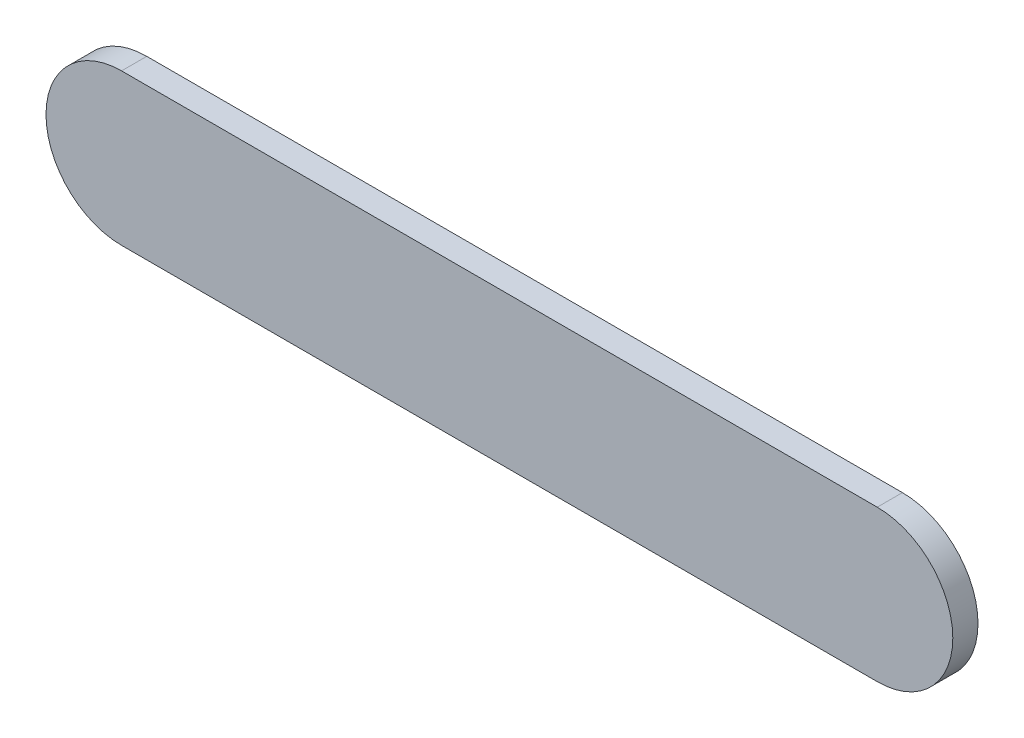
ISO-10303-21;
HEADER;
FILE_DESCRIPTION(('STEP AP214'),'2;1');
FILE_NAME('part.step','',(''),(''),'','','');
FILE_SCHEMA(('AUTOMOTIVE_DESIGN { 1 0 10303 214 1 1 1 1 }'));
ENDSEC;
DATA;
#1=APPLICATION_CONTEXT('core data for automotive mechanical design processes');
#2=APPLICATION_PROTOCOL_DEFINITION('international standard','automotive_design',2000,#1);
#3=PRODUCT_CONTEXT('',#1,'mechanical');
#4=PRODUCT('Part','Part','',(#3));
#5=PRODUCT_RELATED_PRODUCT_CATEGORY('part','',(#4));
#6=PRODUCT_DEFINITION_FORMATION('','',#4);
#7=PRODUCT_DEFINITION_CONTEXT('part definition',#1,'design');
#8=PRODUCT_DEFINITION('design','',#6,#7);
#9=PRODUCT_DEFINITION_SHAPE('','',#8);
#10=(LENGTH_UNIT() NAMED_UNIT(*) SI_UNIT(.MILLI.,.METRE.));
#11=(NAMED_UNIT(*) PLANE_ANGLE_UNIT() SI_UNIT($,.RADIAN.));
#12=(NAMED_UNIT(*) SI_UNIT($,.STERADIAN.) SOLID_ANGLE_UNIT());
#13=UNCERTAINTY_MEASURE_WITH_UNIT(LENGTH_MEASURE(1.E-05),#10,'distance_accuracy_value','');
#14=(GEOMETRIC_REPRESENTATION_CONTEXT(3) GLOBAL_UNCERTAINTY_ASSIGNED_CONTEXT((#13)) GLOBAL_UNIT_ASSIGNED_CONTEXT((#10,
#11,#12)) REPRESENTATION_CONTEXT('',''));
#15=CARTESIAN_POINT('',(0.,0.,0.));
#16=DIRECTION('',(0.,0.,1.));
#17=DIRECTION('',(1.,0.,0.));
#18=AXIS2_PLACEMENT_3D('',#15,#16,#17);
#19=CARTESIAN_POINT('',(0.,0.,5.));
#20=DIRECTION('',(0.,0.,-1.));
#21=DIRECTION('',(-1.,0.,0.));
#22=AXIS2_PLACEMENT_3D('',#19,#20,#21);
#23=CYLINDRICAL_SURFACE('',#22,15.);
#24=CARTESIAN_POINT('',(0.,0.,0.));
#25=DIRECTION('',(0.,0.,1.));
#26=DIRECTION('',(1.,0.,0.));
#27=AXIS2_PLACEMENT_3D('',#24,#25,#26);
#28=CIRCLE('',#27,15.);
#29=CARTESIAN_POINT('',(0.,15.,0.));
#30=VERTEX_POINT('',#29);
#31=CARTESIAN_POINT('',(0.,-15.,0.));
#32=VERTEX_POINT('',#31);
#33=EDGE_CURVE('E100',#30,#32,#28,.T.);
#34=ORIENTED_EDGE('',*,*,#33,.T.);
#35=DIRECTION('',(0.,0.,-1.));
#36=VECTOR('',#35,1.);
#37=CARTESIAN_POINT('',(0.,-15.,5.));
#38=LINE('',#37,#36);
#39=CARTESIAN_POINT('',(0.,-15.,5.));
#40=VERTEX_POINT('',#39);
#41=EDGE_CURVE('E11',#40,#32,#38,.T.);
#42=ORIENTED_EDGE('',*,*,#41,.F.);
#43=CARTESIAN_POINT('',(0.,0.,5.));
#44=DIRECTION('',(0.,0.,1.));
#45=DIRECTION('',(1.,0.,0.));
#46=AXIS2_PLACEMENT_3D('',#43,#44,#45);
#47=CIRCLE('',#46,15.);
#48=CARTESIAN_POINT('',(0.,15.,5.));
#49=VERTEX_POINT('',#48);
#50=EDGE_CURVE('E88',#49,#40,#47,.T.);
#51=ORIENTED_EDGE('',*,*,#50,.F.);
#52=DIRECTION('',(0.,0.,-1.));
#53=VECTOR('',#52,1.);
#54=CARTESIAN_POINT('',(0.,15.,5.));
#55=LINE('',#54,#53);
#56=EDGE_CURVE('E96',#49,#30,#55,.T.);
#57=ORIENTED_EDGE('',*,*,#56,.T.);
#58=EDGE_LOOP('',(#34,#42,#51,#57));
#59=FACE_BOUND('',#58,.T.);
#60=ADVANCED_FACE('F37',(#59),#23,.T.);
#61=CARTESIAN_POINT('',(0.,-15.,5.));
#62=DIRECTION('',(0.,1.,0.));
#63=DIRECTION('',(0.,0.,1.));
#64=AXIS2_PLACEMENT_3D('',#61,#62,#63);
#65=PLANE('',#64);
#66=DIRECTION('',(1.,0.,0.));
#67=VECTOR('',#66,1.);
#68=CARTESIAN_POINT('',(0.,-15.,0.));
#69=LINE('',#68,#67);
#70=CARTESIAN_POINT('',(150.,-15.,0.));
#71=VERTEX_POINT('',#70);
#72=EDGE_CURVE('E92',#32,#71,#69,.T.);
#73=ORIENTED_EDGE('',*,*,#72,.T.);
#74=DIRECTION('',(0.,0.,-1.));
#75=VECTOR('',#74,1.);
#76=CARTESIAN_POINT('',(150.,-15.,5.));
#77=LINE('',#76,#75);
#78=CARTESIAN_POINT('',(150.,-15.,5.));
#79=VERTEX_POINT('',#78);
#80=EDGE_CURVE('E45',#79,#71,#77,.T.);
#81=ORIENTED_EDGE('',*,*,#80,.F.);
#82=DIRECTION('',(1.,0.,0.));
#83=VECTOR('',#82,1.);
#84=CARTESIAN_POINT('',(0.,-15.,5.));
#85=LINE('',#84,#83);
#86=EDGE_CURVE('E83',#40,#79,#85,.T.);
#87=ORIENTED_EDGE('',*,*,#86,.F.);
#88=ORIENTED_EDGE('',*,*,#41,.T.);
#89=EDGE_LOOP('',(#73,#81,#87,#88));
#90=FACE_BOUND('',#89,.T.);
#91=ADVANCED_FACE('F91',(#90),#65,.F.);
#92=CARTESIAN_POINT('',(150.,0.,5.));
#93=DIRECTION('',(0.,0.,-1.));
#94=DIRECTION('',(-1.,0.,0.));
#95=AXIS2_PLACEMENT_3D('',#92,#93,#94);
#96=CYLINDRICAL_SURFACE('',#95,15.);
#97=CARTESIAN_POINT('',(150.,0.,0.));
#98=DIRECTION('',(0.,0.,1.));
#99=DIRECTION('',(1.,0.,0.));
#100=AXIS2_PLACEMENT_3D('',#97,#98,#99);
#101=CIRCLE('',#100,15.);
#102=CARTESIAN_POINT('',(150.,15.,0.));
#103=VERTEX_POINT('',#102);
#104=EDGE_CURVE('E70',#71,#103,#101,.T.);
#105=ORIENTED_EDGE('',*,*,#104,.T.);
#106=DIRECTION('',(0.,0.,-1.));
#107=VECTOR('',#106,1.);
#108=CARTESIAN_POINT('',(150.,15.,5.));
#109=LINE('',#108,#107);
#110=CARTESIAN_POINT('',(150.,15.,5.));
#111=VERTEX_POINT('',#110);
#112=EDGE_CURVE('E93',#111,#103,#109,.T.);
#113=ORIENTED_EDGE('',*,*,#112,.F.);
#114=CARTESIAN_POINT('',(150.,0.,5.));
#115=DIRECTION('',(0.,0.,1.));
#116=DIRECTION('',(1.,0.,0.));
#117=AXIS2_PLACEMENT_3D('',#114,#115,#116);
#118=CIRCLE('',#117,15.);
#119=EDGE_CURVE('E86',#79,#111,#118,.T.);
#120=ORIENTED_EDGE('',*,*,#119,.F.);
#121=ORIENTED_EDGE('',*,*,#80,.T.);
#122=EDGE_LOOP('',(#105,#113,#120,#121));
#123=FACE_BOUND('',#122,.T.);
#124=ADVANCED_FACE('F94',(#123),#96,.T.);
#125=CARTESIAN_POINT('',(0.,15.,5.));
#126=DIRECTION('',(0.,-1.,0.));
#127=DIRECTION('',(0.,0.,-1.));
#128=AXIS2_PLACEMENT_3D('',#125,#126,#127);
#129=PLANE('',#128);
#130=DIRECTION('',(-1.,0.,0.));
#131=VECTOR('',#130,1.);
#132=CARTESIAN_POINT('',(0.,15.,0.));
#133=LINE('',#132,#131);
#134=EDGE_CURVE('E76',#103,#30,#133,.T.);
#135=ORIENTED_EDGE('',*,*,#134,.T.);
#136=ORIENTED_EDGE('',*,*,#56,.F.);
#137=DIRECTION('',(-1.,0.,0.));
#138=VECTOR('',#137,1.);
#139=CARTESIAN_POINT('',(0.,15.,5.));
#140=LINE('',#139,#138);
#141=EDGE_CURVE('E53',#111,#49,#140,.T.);
#142=ORIENTED_EDGE('',*,*,#141,.F.);
#143=ORIENTED_EDGE('',*,*,#112,.T.);
#144=EDGE_LOOP('',(#135,#136,#142,#143));
#145=FACE_BOUND('',#144,.T.);
#146=ADVANCED_FACE('F107',(#145),#129,.F.);
#147=CARTESIAN_POINT('',(0.,0.,5.));
#148=DIRECTION('',(0.,0.,1.));
#149=DIRECTION('',(1.,0.,0.));
#150=AXIS2_PLACEMENT_3D('',#147,#148,#149);
#151=PLANE('',#150);
#152=ORIENTED_EDGE('',*,*,#50,.T.);
#153=ORIENTED_EDGE('',*,*,#86,.T.);
#154=ORIENTED_EDGE('',*,*,#119,.T.);
#155=ORIENTED_EDGE('',*,*,#141,.T.);
#156=EDGE_LOOP('',(#152,#153,#154,#155));
#157=FACE_BOUND('',#156,.T.);
#158=ADVANCED_FACE('F84',(#157),#151,.T.);
#159=CARTESIAN_POINT('',(0.,0.,0.));
#160=DIRECTION('',(0.,0.,1.));
#161=DIRECTION('',(1.,0.,0.));
#162=AXIS2_PLACEMENT_3D('',#159,#160,#161);
#163=PLANE('',#162);
#164=ORIENTED_EDGE('',*,*,#33,.F.);
#165=ORIENTED_EDGE('',*,*,#134,.F.);
#166=ORIENTED_EDGE('',*,*,#104,.F.);
#167=ORIENTED_EDGE('',*,*,#72,.F.);
#168=EDGE_LOOP('',(#164,#165,#166,#167));
#169=FACE_BOUND('',#168,.T.);
#170=ADVANCED_FACE('F110',(#169),#163,.F.);
#171=CLOSED_SHELL('',(#60,#91,#124,#146,#158,#170));
#172=MANIFOLD_SOLID_BREP('B2',#171);
#173=ADVANCED_BREP_SHAPE_REPRESENTATION('',(#18,#172),#14);
#174=SHAPE_DEFINITION_REPRESENTATION(#9,#173);
ENDSEC;
END-ISO-10303-21;
